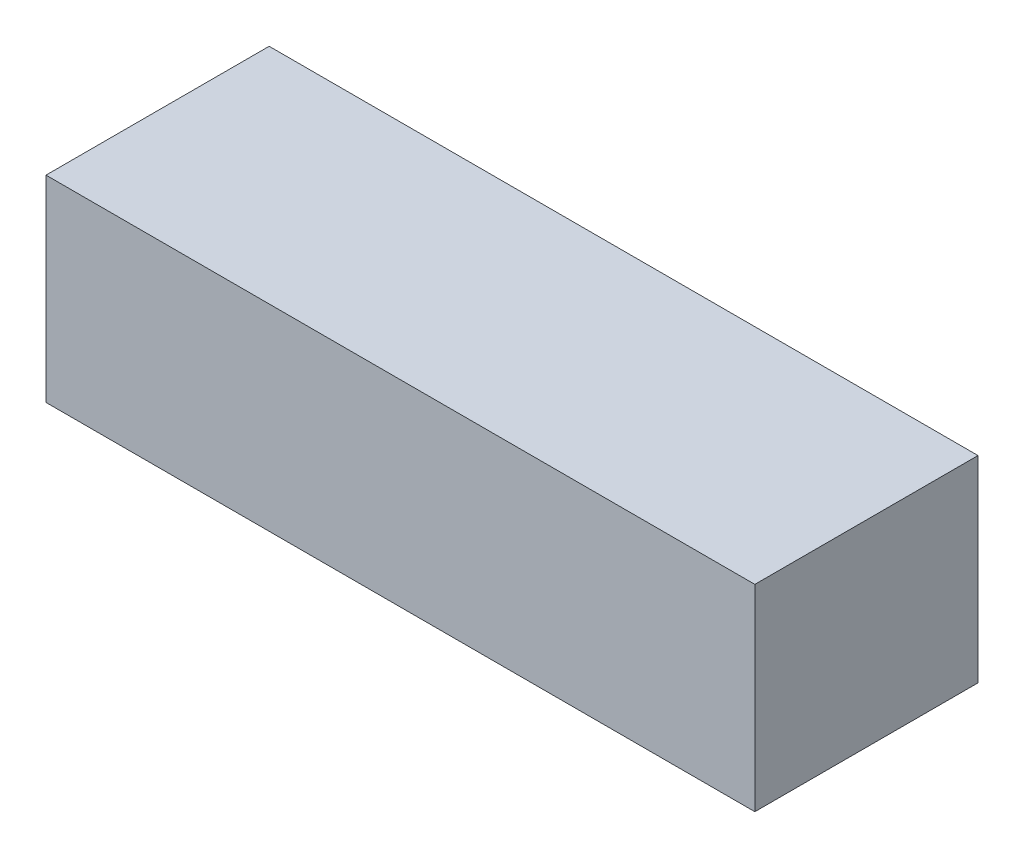
ISO-10303-21;
HEADER;
FILE_DESCRIPTION(('STEP AP214'),'2;1');
FILE_NAME('part.step','',(''),(''),'','','');
FILE_SCHEMA(('AUTOMOTIVE_DESIGN { 1 0 10303 214 1 1 1 1 }'));
ENDSEC;
DATA;
#1=APPLICATION_CONTEXT('core data for automotive mechanical design processes');
#2=APPLICATION_PROTOCOL_DEFINITION('international standard','automotive_design',2000,#1);
#3=PRODUCT_CONTEXT('',#1,'mechanical');
#4=PRODUCT('Part','Part','',(#3));
#5=PRODUCT_RELATED_PRODUCT_CATEGORY('part','',(#4));
#6=PRODUCT_DEFINITION_FORMATION('','',#4);
#7=PRODUCT_DEFINITION_CONTEXT('part definition',#1,'design');
#8=PRODUCT_DEFINITION('design','',#6,#7);
#9=PRODUCT_DEFINITION_SHAPE('','',#8);
#10=(LENGTH_UNIT() NAMED_UNIT(*) SI_UNIT(.MILLI.,.METRE.));
#11=(NAMED_UNIT(*) PLANE_ANGLE_UNIT() SI_UNIT($,.RADIAN.));
#12=(NAMED_UNIT(*) SI_UNIT($,.STERADIAN.) SOLID_ANGLE_UNIT());
#13=UNCERTAINTY_MEASURE_WITH_UNIT(LENGTH_MEASURE(1.E-05),#10,'distance_accuracy_value','');
#14=(GEOMETRIC_REPRESENTATION_CONTEXT(3) GLOBAL_UNCERTAINTY_ASSIGNED_CONTEXT((#13)) GLOBAL_UNIT_ASSIGNED_CONTEXT((#10,
#11,#12)) REPRESENTATION_CONTEXT('',''));
#15=CARTESIAN_POINT('',(0.,0.,0.));
#16=DIRECTION('',(0.,0.,1.));
#17=DIRECTION('',(1.,0.,0.));
#18=AXIS2_PLACEMENT_3D('',#15,#16,#17);
#19=CARTESIAN_POINT('',(-54.,30.,-17.));
#20=DIRECTION('',(1.,0.,0.));
#21=DIRECTION('',(0.,0.,-1.));
#22=AXIS2_PLACEMENT_3D('',#19,#20,#21);
#23=PLANE('',#22);
#24=DIRECTION('',(0.,0.,1.));
#25=VECTOR('',#24,1.);
#26=CARTESIAN_POINT('',(-54.,0.,-17.));
#27=LINE('',#26,#25);
#28=CARTESIAN_POINT('',(-54.,0.,-17.));
#29=VERTEX_POINT('',#28);
#30=CARTESIAN_POINT('',(-54.,0.,17.));
#31=VERTEX_POINT('',#30);
#32=EDGE_CURVE('E105',#29,#31,#27,.T.);
#33=ORIENTED_EDGE('',*,*,#32,.T.);
#34=DIRECTION('',(0.,-1.,0.));
#35=VECTOR('',#34,1.);
#36=CARTESIAN_POINT('',(-54.,30.,17.));
#37=LINE('',#36,#35);
#38=CARTESIAN_POINT('',(-54.,30.,17.));
#39=VERTEX_POINT('',#38);
#40=EDGE_CURVE('E11',#39,#31,#37,.T.);
#41=ORIENTED_EDGE('',*,*,#40,.F.);
#42=DIRECTION('',(0.,0.,1.));
#43=VECTOR('',#42,1.);
#44=CARTESIAN_POINT('',(-54.,30.,-17.));
#45=LINE('',#44,#43);
#46=CARTESIAN_POINT('',(-54.,30.,-17.));
#47=VERTEX_POINT('',#46);
#48=EDGE_CURVE('E89',#47,#39,#45,.T.);
#49=ORIENTED_EDGE('',*,*,#48,.F.);
#50=DIRECTION('',(0.,-1.,0.));
#51=VECTOR('',#50,1.);
#52=CARTESIAN_POINT('',(-54.,30.,-17.));
#53=LINE('',#52,#51);
#54=EDGE_CURVE('E97',#47,#29,#53,.T.);
#55=ORIENTED_EDGE('',*,*,#54,.T.);
#56=EDGE_LOOP('',(#33,#41,#49,#55));
#57=FACE_BOUND('',#56,.T.);
#58=ADVANCED_FACE('F39',(#57),#23,.F.);
#59=CARTESIAN_POINT('',(-54.,30.,17.));
#60=DIRECTION('',(0.,0.,-1.));
#61=DIRECTION('',(-1.,0.,0.));
#62=AXIS2_PLACEMENT_3D('',#59,#60,#61);
#63=PLANE('',#62);
#64=DIRECTION('',(1.,0.,0.));
#65=VECTOR('',#64,1.);
#66=CARTESIAN_POINT('',(-54.,0.,17.));
#67=LINE('',#66,#65);
#68=CARTESIAN_POINT('',(54.,0.,17.));
#69=VERTEX_POINT('',#68);
#70=EDGE_CURVE('E92',#31,#69,#67,.T.);
#71=ORIENTED_EDGE('',*,*,#70,.T.);
#72=DIRECTION('',(0.,-1.,0.));
#73=VECTOR('',#72,1.);
#74=CARTESIAN_POINT('',(54.,30.,17.));
#75=LINE('',#74,#73);
#76=CARTESIAN_POINT('',(54.,30.,17.));
#77=VERTEX_POINT('',#76);
#78=EDGE_CURVE('E50',#77,#69,#75,.T.);
#79=ORIENTED_EDGE('',*,*,#78,.F.);
#80=DIRECTION('',(1.,0.,0.));
#81=VECTOR('',#80,1.);
#82=CARTESIAN_POINT('',(-54.,30.,17.));
#83=LINE('',#82,#81);
#84=EDGE_CURVE('E82',#39,#77,#83,.T.);
#85=ORIENTED_EDGE('',*,*,#84,.F.);
#86=ORIENTED_EDGE('',*,*,#40,.T.);
#87=EDGE_LOOP('',(#71,#79,#85,#86));
#88=FACE_BOUND('',#87,.T.);
#89=ADVANCED_FACE('F93',(#88),#63,.F.);
#90=CARTESIAN_POINT('',(54.,30.,17.));
#91=DIRECTION('',(-1.,0.,0.));
#92=DIRECTION('',(0.,0.,1.));
#93=AXIS2_PLACEMENT_3D('',#90,#91,#92);
#94=PLANE('',#93);
#95=DIRECTION('',(0.,0.,-1.));
#96=VECTOR('',#95,1.);
#97=CARTESIAN_POINT('',(54.,0.,17.));
#98=LINE('',#97,#96);
#99=CARTESIAN_POINT('',(54.,0.,-17.));
#100=VERTEX_POINT('',#99);
#101=EDGE_CURVE('E72',#69,#100,#98,.T.);
#102=ORIENTED_EDGE('',*,*,#101,.T.);
#103=DIRECTION('',(0.,-1.,0.));
#104=VECTOR('',#103,1.);
#105=CARTESIAN_POINT('',(54.,30.,-17.));
#106=LINE('',#105,#104);
#107=CARTESIAN_POINT('',(54.,30.,-17.));
#108=VERTEX_POINT('',#107);
#109=EDGE_CURVE('E94',#108,#100,#106,.T.);
#110=ORIENTED_EDGE('',*,*,#109,.F.);
#111=DIRECTION('',(0.,0.,-1.));
#112=VECTOR('',#111,1.);
#113=CARTESIAN_POINT('',(54.,30.,17.));
#114=LINE('',#113,#112);
#115=EDGE_CURVE('E88',#77,#108,#114,.T.);
#116=ORIENTED_EDGE('',*,*,#115,.F.);
#117=ORIENTED_EDGE('',*,*,#78,.T.);
#118=EDGE_LOOP('',(#102,#110,#116,#117));
#119=FACE_BOUND('',#118,.T.);
#120=ADVANCED_FACE('F96',(#119),#94,.F.);
#121=CARTESIAN_POINT('',(54.,30.,-17.));
#122=DIRECTION('',(0.,0.,1.));
#123=DIRECTION('',(1.,0.,0.));
#124=AXIS2_PLACEMENT_3D('',#121,#122,#123);
#125=PLANE('',#124);
#126=DIRECTION('',(-1.,0.,0.));
#127=VECTOR('',#126,1.);
#128=CARTESIAN_POINT('',(54.,0.,-17.));
#129=LINE('',#128,#127);
#130=EDGE_CURVE('E76',#100,#29,#129,.T.);
#131=ORIENTED_EDGE('',*,*,#130,.T.);
#132=ORIENTED_EDGE('',*,*,#54,.F.);
#133=DIRECTION('',(-1.,0.,0.));
#134=VECTOR('',#133,1.);
#135=CARTESIAN_POINT('',(54.,30.,-17.));
#136=LINE('',#135,#134);
#137=EDGE_CURVE('E54',#108,#47,#136,.T.);
#138=ORIENTED_EDGE('',*,*,#137,.F.);
#139=ORIENTED_EDGE('',*,*,#109,.T.);
#140=EDGE_LOOP('',(#131,#132,#138,#139));
#141=FACE_BOUND('',#140,.T.);
#142=ADVANCED_FACE('F108',(#141),#125,.F.);
#143=CARTESIAN_POINT('',(0.,30.,0.));
#144=DIRECTION('',(0.,1.,0.));
#145=DIRECTION('',(0.,0.,1.));
#146=AXIS2_PLACEMENT_3D('',#143,#144,#145);
#147=PLANE('',#146);
#148=ORIENTED_EDGE('',*,*,#48,.T.);
#149=ORIENTED_EDGE('',*,*,#84,.T.);
#150=ORIENTED_EDGE('',*,*,#115,.T.);
#151=ORIENTED_EDGE('',*,*,#137,.T.);
#152=EDGE_LOOP('',(#148,#149,#150,#151));
#153=FACE_BOUND('',#152,.T.);
#154=ADVANCED_FACE('F86',(#153),#147,.T.);
#155=CARTESIAN_POINT('',(0.,0.,0.));
#156=DIRECTION('',(0.,1.,0.));
#157=DIRECTION('',(0.,0.,1.));
#158=AXIS2_PLACEMENT_3D('',#155,#156,#157);
#159=PLANE('',#158);
#160=ORIENTED_EDGE('',*,*,#32,.F.);
#161=ORIENTED_EDGE('',*,*,#130,.F.);
#162=ORIENTED_EDGE('',*,*,#101,.F.);
#163=ORIENTED_EDGE('',*,*,#70,.F.);
#164=EDGE_LOOP('',(#160,#161,#162,#163));
#165=FACE_BOUND('',#164,.T.);
#166=ADVANCED_FACE('F115',(#165),#159,.F.);
#167=CLOSED_SHELL('',(#58,#89,#120,#142,#154,#166));
#168=MANIFOLD_SOLID_BREP('B2',#167);
#169=ADVANCED_BREP_SHAPE_REPRESENTATION('',(#18,#168),#14);
#170=SHAPE_DEFINITION_REPRESENTATION(#9,#169);
ENDSEC;
END-ISO-10303-21;
